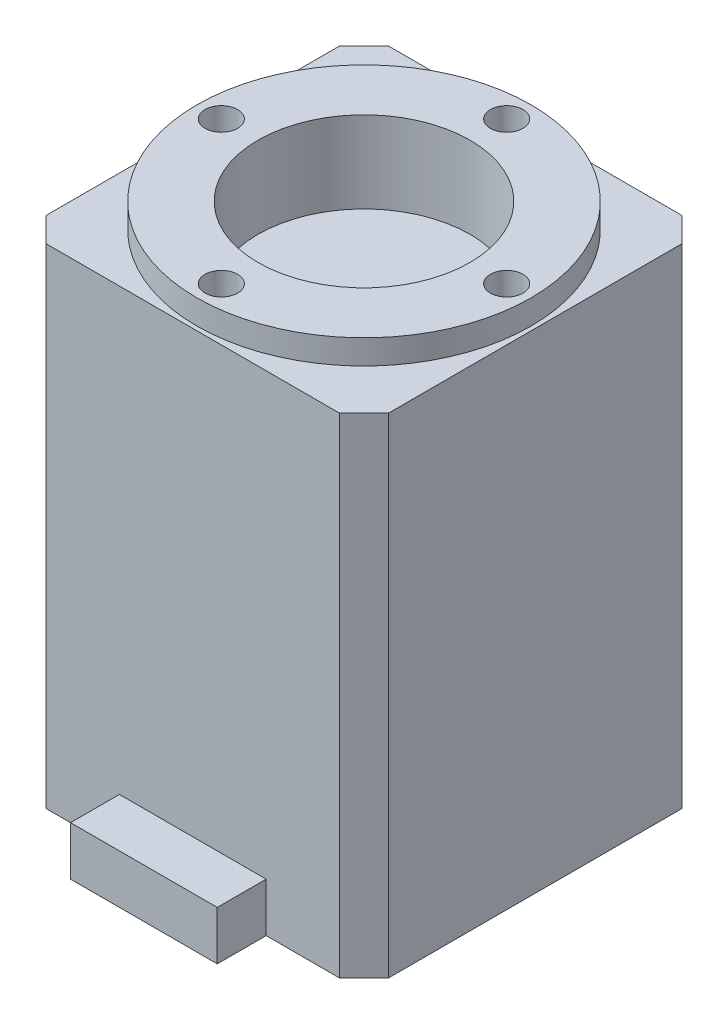
ISO-10303-21;
HEADER;
FILE_DESCRIPTION(('STEP AP214'),'2;1');
FILE_NAME('part.step','',(''),(''),'','','');
FILE_SCHEMA(('AUTOMOTIVE_DESIGN { 1 0 10303 214 1 1 1 1 }'));
ENDSEC;
DATA;
#1=APPLICATION_CONTEXT('core data for automotive mechanical design processes');
#2=APPLICATION_PROTOCOL_DEFINITION('international standard','automotive_design',2000,#1);
#3=PRODUCT_CONTEXT('',#1,'mechanical');
#4=PRODUCT('Part','Part','',(#3));
#5=PRODUCT_RELATED_PRODUCT_CATEGORY('part','',(#4));
#6=PRODUCT_DEFINITION_FORMATION('','',#4);
#7=PRODUCT_DEFINITION_CONTEXT('part definition',#1,'design');
#8=PRODUCT_DEFINITION('design','',#6,#7);
#9=PRODUCT_DEFINITION_SHAPE('','',#8);
#10=(LENGTH_UNIT() NAMED_UNIT(*) SI_UNIT(.MILLI.,.METRE.));
#11=(NAMED_UNIT(*) PLANE_ANGLE_UNIT() SI_UNIT($,.RADIAN.));
#12=(NAMED_UNIT(*) SI_UNIT($,.STERADIAN.) SOLID_ANGLE_UNIT());
#13=UNCERTAINTY_MEASURE_WITH_UNIT(LENGTH_MEASURE(1.E-05),#10,'distance_accuracy_value','');
#14=(GEOMETRIC_REPRESENTATION_CONTEXT(3) GLOBAL_UNCERTAINTY_ASSIGNED_CONTEXT((#13)) GLOBAL_UNIT_ASSIGNED_CONTEXT((#10,
#11,#12)) REPRESENTATION_CONTEXT('',''));
#15=CARTESIAN_POINT('',(0.,0.,0.));
#16=DIRECTION('',(0.,0.,1.));
#17=DIRECTION('',(1.,0.,0.));
#18=AXIS2_PLACEMENT_3D('',#15,#16,#17);
#19=CARTESIAN_POINT('',(0.,60.,0.));
#20=DIRECTION('',(0.,0.,-1.));
#21=DIRECTION('',(-1.,0.,0.));
#22=AXIS2_PLACEMENT_3D('',#19,#20,#21);
#23=PLANE('',#22);
#24=DIRECTION('',(0.,-1.,0.));
#25=VECTOR('',#24,1.);
#26=CARTESIAN_POINT('',(12.,6.,0.));
#27=LINE('',#26,#25);
#28=CARTESIAN_POINT('',(12.,6.,0.));
#29=VERTEX_POINT('',#28);
#30=CARTESIAN_POINT('',(12.,0.,0.));
#31=VERTEX_POINT('',#30);
#32=EDGE_CURVE('E63',#29,#31,#27,.T.);
#33=ORIENTED_EDGE('',*,*,#32,.F.);
#34=DIRECTION('',(-1.,0.,0.));
#35=VECTOR('',#34,1.);
#36=CARTESIAN_POINT('',(12.,6.,0.));
#37=LINE('',#36,#35);
#38=CARTESIAN_POINT('',(30.,6.,0.));
#39=VERTEX_POINT('',#38);
#40=EDGE_CURVE('E157',#39,#29,#37,.T.);
#41=ORIENTED_EDGE('',*,*,#40,.F.);
#42=DIRECTION('',(0.,1.,0.));
#43=VECTOR('',#42,1.);
#44=CARTESIAN_POINT('',(30.,6.,0.));
#45=LINE('',#44,#43);
#46=CARTESIAN_POINT('',(30.,0.,0.));
#47=VERTEX_POINT('',#46);
#48=EDGE_CURVE('E69',#47,#39,#45,.T.);
#49=ORIENTED_EDGE('',*,*,#48,.F.);
#50=DIRECTION('',(1.,0.,0.));
#51=VECTOR('',#50,1.);
#52=CARTESIAN_POINT('',(0.,0.,0.));
#53=LINE('',#52,#51);
#54=CARTESIAN_POINT('',(39.,0.,0.));
#55=VERTEX_POINT('',#54);
#56=EDGE_CURVE('E218',#47,#55,#53,.T.);
#57=ORIENTED_EDGE('',*,*,#56,.T.);
#58=DIRECTION('',(0.,1.,0.));
#59=VECTOR('',#58,1.);
#60=CARTESIAN_POINT('',(39.,60.,0.));
#61=LINE('',#60,#59);
#62=CARTESIAN_POINT('',(39.,60.,0.));
#63=VERTEX_POINT('',#62);
#64=EDGE_CURVE('E255',#55,#63,#61,.T.);
#65=ORIENTED_EDGE('',*,*,#64,.T.);
#66=DIRECTION('',(1.,0.,0.));
#67=VECTOR('',#66,1.);
#68=CARTESIAN_POINT('',(0.,60.,0.));
#69=LINE('',#68,#67);
#70=CARTESIAN_POINT('',(3.,60.,0.));
#71=VERTEX_POINT('',#70);
#72=EDGE_CURVE('E207',#71,#63,#69,.T.);
#73=ORIENTED_EDGE('',*,*,#72,.F.);
#74=DIRECTION('',(0.,-1.,0.));
#75=VECTOR('',#74,1.);
#76=CARTESIAN_POINT('',(3.,60.,0.));
#77=LINE('',#76,#75);
#78=CARTESIAN_POINT('',(3.,0.,0.));
#79=VERTEX_POINT('',#78);
#80=EDGE_CURVE('E252',#71,#79,#77,.T.);
#81=ORIENTED_EDGE('',*,*,#80,.T.);
#82=EDGE_CURVE('E219',#79,#31,#53,.T.);
#83=ORIENTED_EDGE('',*,*,#82,.T.);
#84=EDGE_LOOP('',(#33,#41,#49,#57,#65,#73,#81,#83));
#85=FACE_BOUND('',#84,.T.);
#86=ADVANCED_FACE('F47',(#85),#23,.F.);
#87=CARTESIAN_POINT('',(0.,60.,0.));
#88=DIRECTION('',(1.,0.,0.));
#89=DIRECTION('',(0.,0.,-1.));
#90=AXIS2_PLACEMENT_3D('',#87,#88,#89);
#91=PLANE('',#90);
#92=DIRECTION('',(0.,0.,1.));
#93=VECTOR('',#92,1.);
#94=CARTESIAN_POINT('',(0.,60.,0.));
#95=LINE('',#94,#93);
#96=CARTESIAN_POINT('',(0.,60.,-39.));
#97=VERTEX_POINT('',#96);
#98=CARTESIAN_POINT('',(0.,60.,-2.99999999999999));
#99=VERTEX_POINT('',#98);
#100=EDGE_CURVE('E204',#97,#99,#95,.T.);
#101=ORIENTED_EDGE('',*,*,#100,.F.);
#102=DIRECTION('',(0.,-1.,0.));
#103=VECTOR('',#102,1.);
#104=CARTESIAN_POINT('',(0.,60.,-39.));
#105=LINE('',#104,#103);
#106=CARTESIAN_POINT('',(0.,0.,-39.));
#107=VERTEX_POINT('',#106);
#108=EDGE_CURVE('E11',#97,#107,#105,.T.);
#109=ORIENTED_EDGE('',*,*,#108,.T.);
#110=DIRECTION('',(0.,0.,1.));
#111=VECTOR('',#110,1.);
#112=CARTESIAN_POINT('',(0.,0.,0.));
#113=LINE('',#112,#111);
#114=CARTESIAN_POINT('',(0.,0.,-2.99999999999999));
#115=VERTEX_POINT('',#114);
#116=EDGE_CURVE('E198',#107,#115,#113,.T.);
#117=ORIENTED_EDGE('',*,*,#116,.T.);
#118=DIRECTION('',(0.,1.,0.));
#119=VECTOR('',#118,1.);
#120=CARTESIAN_POINT('',(0.,60.,-2.99999999999999));
#121=LINE('',#120,#119);
#122=EDGE_CURVE('E56',#115,#99,#121,.T.);
#123=ORIENTED_EDGE('',*,*,#122,.T.);
#124=EDGE_LOOP('',(#101,#109,#117,#123));
#125=FACE_BOUND('',#124,.T.);
#126=ADVANCED_FACE('F259',(#125),#91,.F.);
#127=CARTESIAN_POINT('',(42.,60.,0.));
#128=DIRECTION('',(-1.,0.,0.));
#129=DIRECTION('',(0.,0.,1.));
#130=AXIS2_PLACEMENT_3D('',#127,#128,#129);
#131=PLANE('',#130);
#132=DIRECTION('',(0.,0.,-1.));
#133=VECTOR('',#132,1.);
#134=CARTESIAN_POINT('',(42.,0.,0.));
#135=LINE('',#134,#133);
#136=CARTESIAN_POINT('',(42.,0.,-3.));
#137=VERTEX_POINT('',#136);
#138=CARTESIAN_POINT('',(42.,0.,-39.));
#139=VERTEX_POINT('',#138);
#140=EDGE_CURVE('E221',#137,#139,#135,.T.);
#141=ORIENTED_EDGE('',*,*,#140,.T.);
#142=DIRECTION('',(0.,1.,0.));
#143=VECTOR('',#142,1.);
#144=CARTESIAN_POINT('',(42.,60.,-39.));
#145=LINE('',#144,#143);
#146=CARTESIAN_POINT('',(42.,60.,-39.));
#147=VERTEX_POINT('',#146);
#148=EDGE_CURVE('E242',#139,#147,#145,.T.);
#149=ORIENTED_EDGE('',*,*,#148,.T.);
#150=DIRECTION('',(0.,0.,-1.));
#151=VECTOR('',#150,1.);
#152=CARTESIAN_POINT('',(42.,60.,0.));
#153=LINE('',#152,#151);
#154=CARTESIAN_POINT('',(42.,60.,-3.));
#155=VERTEX_POINT('',#154);
#156=EDGE_CURVE('E211',#155,#147,#153,.T.);
#157=ORIENTED_EDGE('',*,*,#156,.F.);
#158=DIRECTION('',(0.,-1.,0.));
#159=VECTOR('',#158,1.);
#160=CARTESIAN_POINT('',(42.,60.,-3.));
#161=LINE('',#160,#159);
#162=EDGE_CURVE('E239',#155,#137,#161,.T.);
#163=ORIENTED_EDGE('',*,*,#162,.T.);
#164=EDGE_LOOP('',(#141,#149,#157,#163));
#165=FACE_BOUND('',#164,.T.);
#166=ADVANCED_FACE('F292',(#165),#131,.F.);
#167=CARTESIAN_POINT('',(0.,60.,-42.));
#168=DIRECTION('',(0.,0.,1.));
#169=DIRECTION('',(1.,0.,0.));
#170=AXIS2_PLACEMENT_3D('',#167,#168,#169);
#171=PLANE('',#170);
#172=DIRECTION('',(-1.,0.,0.));
#173=VECTOR('',#172,1.);
#174=CARTESIAN_POINT('',(0.,60.,-42.));
#175=LINE('',#174,#173);
#176=CARTESIAN_POINT('',(39.,60.,-42.));
#177=VERTEX_POINT('',#176);
#178=CARTESIAN_POINT('',(3.00000000000002,60.,-42.));
#179=VERTEX_POINT('',#178);
#180=EDGE_CURVE('E203',#177,#179,#175,.T.);
#181=ORIENTED_EDGE('',*,*,#180,.F.);
#182=DIRECTION('',(0.,-1.,0.));
#183=VECTOR('',#182,1.);
#184=CARTESIAN_POINT('',(39.,60.,-42.));
#185=LINE('',#184,#183);
#186=CARTESIAN_POINT('',(39.,0.,-42.));
#187=VERTEX_POINT('',#186);
#188=EDGE_CURVE('E227',#177,#187,#185,.T.);
#189=ORIENTED_EDGE('',*,*,#188,.T.);
#190=DIRECTION('',(-1.,0.,0.));
#191=VECTOR('',#190,1.);
#192=CARTESIAN_POINT('',(0.,0.,-42.));
#193=LINE('',#192,#191);
#194=CARTESIAN_POINT('',(3.00000000000002,0.,-42.));
#195=VERTEX_POINT('',#194);
#196=EDGE_CURVE('E208',#187,#195,#193,.T.);
#197=ORIENTED_EDGE('',*,*,#196,.T.);
#198=DIRECTION('',(0.,1.,0.));
#199=VECTOR('',#198,1.);
#200=CARTESIAN_POINT('',(3.00000000000002,60.,-42.));
#201=LINE('',#200,#199);
#202=EDGE_CURVE('E202',#195,#179,#201,.T.);
#203=ORIENTED_EDGE('',*,*,#202,.T.);
#204=EDGE_LOOP('',(#181,#189,#197,#203));
#205=FACE_BOUND('',#204,.T.);
#206=ADVANCED_FACE('F273',(#205),#171,.F.);
#207=CARTESIAN_POINT('',(0.,60.,0.));
#208=DIRECTION('',(0.,-1.,0.));
#209=DIRECTION('',(0.,0.,-1.));
#210=AXIS2_PLACEMENT_3D('',#207,#208,#209);
#211=PLANE('',#210);
#212=CARTESIAN_POINT('',(21.,60.,-21.));
#213=DIRECTION('',(0.,1.,0.));
#214=DIRECTION('',(0.,0.,1.));
#215=AXIS2_PLACEMENT_3D('',#212,#213,#214);
#216=CIRCLE('',#215,20.5);
#217=CARTESIAN_POINT('',(21.,60.,-0.499999999999997));
#218=VERTEX_POINT('',#217);
#219=EDGE_CURVE('E199',#218,#218,#216,.T.);
#220=ORIENTED_EDGE('',*,*,#219,.F.);
#221=EDGE_LOOP('',(#220));
#222=FACE_BOUND('',#221,.T.);
#223=ORIENTED_EDGE('',*,*,#156,.T.);
#224=DIRECTION('',(0.707106781186544,0.,0.707106781186551));
#225=VECTOR('',#224,1.);
#226=CARTESIAN_POINT('',(39.,60.,-42.));
#227=LINE('',#226,#225);
#228=EDGE_CURVE('E250',#147,#177,#227,.F.);
#229=ORIENTED_EDGE('',*,*,#228,.T.);
#230=ORIENTED_EDGE('',*,*,#180,.T.);
#231=DIRECTION('',(0.70710678118655,0.,-0.707106781186545));
#232=VECTOR('',#231,1.);
#233=CARTESIAN_POINT('',(0.,60.,-39.));
#234=LINE('',#233,#232);
#235=EDGE_CURVE('E246',#179,#97,#234,.F.);
#236=ORIENTED_EDGE('',*,*,#235,.T.);
#237=ORIENTED_EDGE('',*,*,#100,.T.);
#238=DIRECTION('',(-0.707106781186548,0.,-0.707106781186547));
#239=VECTOR('',#238,1.);
#240=CARTESIAN_POINT('',(3.,60.,0.));
#241=LINE('',#240,#239);
#242=EDGE_CURVE('E244',#99,#71,#241,.F.);
#243=ORIENTED_EDGE('',*,*,#242,.T.);
#244=ORIENTED_EDGE('',*,*,#72,.T.);
#245=DIRECTION('',(-0.707106781186548,0.,0.707106781186547));
#246=VECTOR('',#245,1.);
#247=CARTESIAN_POINT('',(42.,60.,-3.));
#248=LINE('',#247,#246);
#249=EDGE_CURVE('E248',#63,#155,#248,.F.);
#250=ORIENTED_EDGE('',*,*,#249,.T.);
#251=EDGE_LOOP('',(#223,#229,#230,#236,#237,#243,#244,#250));
#252=FACE_BOUND('',#251,.T.);
#253=ADVANCED_FACE('F265',(#222,#252),#211,.F.);
#254=CARTESIAN_POINT('',(0.,0.,0.));
#255=DIRECTION('',(0.,-1.,0.));
#256=DIRECTION('',(0.,0.,-1.));
#257=AXIS2_PLACEMENT_3D('',#254,#255,#256);
#258=PLANE('',#257);
#259=ORIENTED_EDGE('',*,*,#196,.F.);
#260=DIRECTION('',(-0.707106781186544,0.,-0.707106781186551));
#261=VECTOR('',#260,1.);
#262=CARTESIAN_POINT('',(40.5000000000002,0.,-40.4999999999998));
#263=LINE('',#262,#261);
#264=EDGE_CURVE('E237',#187,#139,#263,.F.);
#265=ORIENTED_EDGE('',*,*,#264,.T.);
#266=ORIENTED_EDGE('',*,*,#140,.F.);
#267=DIRECTION('',(0.707106781186548,0.,-0.707106781186547));
#268=VECTOR('',#267,1.);
#269=CARTESIAN_POINT('',(19.5,0.,19.5));
#270=LINE('',#269,#268);
#271=EDGE_CURVE('E234',#137,#55,#270,.F.);
#272=ORIENTED_EDGE('',*,*,#271,.T.);
#273=ORIENTED_EDGE('',*,*,#56,.F.);
#274=DIRECTION('',(0.,0.,-1.));
#275=VECTOR('',#274,1.);
#276=CARTESIAN_POINT('',(30.,0.,6.));
#277=LINE('',#276,#275);
#278=CARTESIAN_POINT('',(30.,0.,6.));
#279=VERTEX_POINT('',#278);
#280=EDGE_CURVE('E144',#279,#47,#277,.T.);
#281=ORIENTED_EDGE('',*,*,#280,.F.);
#282=DIRECTION('',(1.,0.,0.));
#283=VECTOR('',#282,1.);
#284=CARTESIAN_POINT('',(12.,0.,6.));
#285=LINE('',#284,#283);
#286=CARTESIAN_POINT('',(12.,0.,6.));
#287=VERTEX_POINT('',#286);
#288=EDGE_CURVE('E136',#287,#279,#285,.T.);
#289=ORIENTED_EDGE('',*,*,#288,.F.);
#290=DIRECTION('',(0.,0.,-1.));
#291=VECTOR('',#290,1.);
#292=CARTESIAN_POINT('',(12.,0.,6.));
#293=LINE('',#292,#291);
#294=EDGE_CURVE('E142',#287,#31,#293,.T.);
#295=ORIENTED_EDGE('',*,*,#294,.T.);
#296=ORIENTED_EDGE('',*,*,#82,.F.);
#297=DIRECTION('',(0.707106781186548,0.,0.707106781186547));
#298=VECTOR('',#297,1.);
#299=CARTESIAN_POINT('',(1.5,0.,-1.5));
#300=LINE('',#299,#298);
#301=EDGE_CURVE('E230',#79,#115,#300,.F.);
#302=ORIENTED_EDGE('',*,*,#301,.T.);
#303=ORIENTED_EDGE('',*,*,#116,.F.);
#304=DIRECTION('',(-0.70710678118655,0.,0.707106781186545));
#305=VECTOR('',#304,1.);
#306=CARTESIAN_POINT('',(-19.5,0.,-19.5000000000001));
#307=LINE('',#306,#305);
#308=EDGE_CURVE('E232',#107,#195,#307,.F.);
#309=ORIENTED_EDGE('',*,*,#308,.T.);
#310=EDGE_LOOP('',(#259,#265,#266,#272,#273,#281,#289,#295,#296,#302,#303,#309));
#311=FACE_BOUND('',#310,.T.);
#312=ADVANCED_FACE('F139',(#311),#258,.T.);
#313=CARTESIAN_POINT('',(21.,63.,-21.));
#314=DIRECTION('',(0.,-1.,0.));
#315=DIRECTION('',(0.,0.,-1.));
#316=AXIS2_PLACEMENT_3D('',#313,#314,#315);
#317=CYLINDRICAL_SURFACE('',#316,20.5);
#318=CARTESIAN_POINT('',(21.,63.,-21.));
#319=DIRECTION('',(0.,1.,0.));
#320=DIRECTION('',(0.,0.,1.));
#321=AXIS2_PLACEMENT_3D('',#318,#319,#320);
#322=CIRCLE('',#321,20.5);
#323=CARTESIAN_POINT('',(21.,63.,-0.499999999999997));
#324=VERTEX_POINT('',#323);
#325=EDGE_CURVE('E193',#324,#324,#322,.T.);
#326=ORIENTED_EDGE('',*,*,#325,.F.);
#327=EDGE_LOOP('',(#326));
#328=FACE_BOUND('',#327,.T.);
#329=ORIENTED_EDGE('',*,*,#219,.T.);
#330=EDGE_LOOP('',(#329));
#331=FACE_BOUND('',#330,.T.);
#332=ADVANCED_FACE('F386',(#328,#331),#317,.T.);
#333=CARTESIAN_POINT('',(21.,63.,-21.));
#334=DIRECTION('',(0.,1.,0.));
#335=DIRECTION('',(0.,0.,1.));
#336=AXIS2_PLACEMENT_3D('',#333,#334,#335);
#337=PLANE('',#336);
#338=CARTESIAN_POINT('',(3.5,63.,-21.));
#339=DIRECTION('',(0.,1.,0.));
#340=DIRECTION('',(0.,0.,1.));
#341=AXIS2_PLACEMENT_3D('',#338,#339,#340);
#342=CIRCLE('',#341,2.);
#343=CARTESIAN_POINT('',(3.5,63.,-19.));
#344=VERTEX_POINT('',#343);
#345=EDGE_CURVE('E173',#344,#344,#342,.T.);
#346=ORIENTED_EDGE('',*,*,#345,.F.);
#347=EDGE_LOOP('',(#346));
#348=FACE_BOUND('',#347,.T.);
#349=CARTESIAN_POINT('',(21.,63.,-38.5));
#350=DIRECTION('',(0.,1.,0.));
#351=DIRECTION('',(0.,0.,1.));
#352=AXIS2_PLACEMENT_3D('',#349,#350,#351);
#353=CIRCLE('',#352,2.00000000000001);
#354=CARTESIAN_POINT('',(21.,63.,-36.5));
#355=VERTEX_POINT('',#354);
#356=EDGE_CURVE('E176',#355,#355,#353,.T.);
#357=ORIENTED_EDGE('',*,*,#356,.F.);
#358=EDGE_LOOP('',(#357));
#359=FACE_BOUND('',#358,.T.);
#360=CARTESIAN_POINT('',(38.5,63.,-21.));
#361=DIRECTION('',(0.,1.,0.));
#362=DIRECTION('',(0.,0.,1.));
#363=AXIS2_PLACEMENT_3D('',#360,#361,#362);
#364=CIRCLE('',#363,2.);
#365=CARTESIAN_POINT('',(38.5,63.,-19.));
#366=VERTEX_POINT('',#365);
#367=EDGE_CURVE('E182',#366,#366,#364,.T.);
#368=ORIENTED_EDGE('',*,*,#367,.F.);
#369=EDGE_LOOP('',(#368));
#370=FACE_BOUND('',#369,.T.);
#371=CARTESIAN_POINT('',(21.,63.,-3.5));
#372=DIRECTION('',(0.,1.,0.));
#373=DIRECTION('',(0.,0.,1.));
#374=AXIS2_PLACEMENT_3D('',#371,#372,#373);
#375=CIRCLE('',#374,2.);
#376=CARTESIAN_POINT('',(21.,63.,-1.5));
#377=VERTEX_POINT('',#376);
#378=EDGE_CURVE('E163',#377,#377,#375,.T.);
#379=ORIENTED_EDGE('',*,*,#378,.F.);
#380=EDGE_LOOP('',(#379));
#381=FACE_BOUND('',#380,.T.);
#382=CARTESIAN_POINT('',(21.,63.,-21.));
#383=DIRECTION('',(0.,1.,0.));
#384=DIRECTION('',(0.,0.,1.));
#385=AXIS2_PLACEMENT_3D('',#382,#383,#384);
#386=CIRCLE('',#385,13.);
#387=CARTESIAN_POINT('',(21.,63.,-8.));
#388=VERTEX_POINT('',#387);
#389=EDGE_CURVE('E172',#388,#388,#386,.T.);
#390=ORIENTED_EDGE('',*,*,#389,.F.);
#391=EDGE_LOOP('',(#390));
#392=FACE_BOUND('',#391,.T.);
#393=ORIENTED_EDGE('',*,*,#325,.T.);
#394=EDGE_LOOP('',(#393));
#395=FACE_BOUND('',#394,.T.);
#396=ADVANCED_FACE('F382',(#348,#359,#370,#381,#392,#395),#337,.T.);
#397=CARTESIAN_POINT('',(21.,53.,-21.));
#398=DIRECTION('',(0.,1.,0.));
#399=DIRECTION('',(0.,0.,1.));
#400=AXIS2_PLACEMENT_3D('',#397,#398,#399);
#401=CYLINDRICAL_SURFACE('',#400,13.);
#402=CARTESIAN_POINT('',(21.,53.,-21.));
#403=DIRECTION('',(0.,1.,0.));
#404=DIRECTION('',(0.,0.,1.));
#405=AXIS2_PLACEMENT_3D('',#402,#403,#404);
#406=CIRCLE('',#405,13.);
#407=CARTESIAN_POINT('',(21.,53.,-8.));
#408=VERTEX_POINT('',#407);
#409=EDGE_CURVE('E190',#408,#408,#406,.T.);
#410=ORIENTED_EDGE('',*,*,#409,.F.);
#411=EDGE_LOOP('',(#410));
#412=FACE_BOUND('',#411,.T.);
#413=ORIENTED_EDGE('',*,*,#389,.T.);
#414=EDGE_LOOP('',(#413));
#415=FACE_BOUND('',#414,.T.);
#416=ADVANCED_FACE('F378',(#412,#415),#401,.F.);
#417=CARTESIAN_POINT('',(21.,53.,-21.));
#418=DIRECTION('',(0.,1.,0.));
#419=DIRECTION('',(0.,0.,1.));
#420=AXIS2_PLACEMENT_3D('',#417,#418,#419);
#421=PLANE('',#420);
#422=ORIENTED_EDGE('',*,*,#409,.T.);
#423=EDGE_LOOP('',(#422));
#424=FACE_BOUND('',#423,.T.);
#425=ADVANCED_FACE('F371',(#424),#421,.T.);
#426=CARTESIAN_POINT('',(21.,59.5,-3.5));
#427=DIRECTION('',(0.,1.,0.));
#428=DIRECTION('',(0.,0.,1.));
#429=AXIS2_PLACEMENT_3D('',#426,#427,#428);
#430=CYLINDRICAL_SURFACE('',#429,2.);
#431=CARTESIAN_POINT('',(21.,59.5,-3.5));
#432=DIRECTION('',(0.,1.,0.));
#433=DIRECTION('',(0.,0.,1.));
#434=AXIS2_PLACEMENT_3D('',#431,#432,#433);
#435=CIRCLE('',#434,2.);
#436=CARTESIAN_POINT('',(21.,59.5,-1.5));
#437=VERTEX_POINT('',#436);
#438=EDGE_CURVE('E160',#437,#437,#435,.T.);
#439=ORIENTED_EDGE('',*,*,#438,.F.);
#440=EDGE_LOOP('',(#439));
#441=FACE_BOUND('',#440,.T.);
#442=ORIENTED_EDGE('',*,*,#378,.T.);
#443=EDGE_LOOP('',(#442));
#444=FACE_BOUND('',#443,.T.);
#445=ADVANCED_FACE('F368',(#441,#444),#430,.F.);
#446=CARTESIAN_POINT('',(21.,59.5,-3.5));
#447=DIRECTION('',(0.,1.,0.));
#448=DIRECTION('',(0.,0.,1.));
#449=AXIS2_PLACEMENT_3D('',#446,#447,#448);
#450=PLANE('',#449);
#451=ORIENTED_EDGE('',*,*,#438,.T.);
#452=EDGE_LOOP('',(#451));
#453=FACE_BOUND('',#452,.T.);
#454=ADVANCED_FACE('F363',(#453),#450,.T.);
#455=CARTESIAN_POINT('',(38.5,59.5,-21.));
#456=DIRECTION('',(0.,1.,0.));
#457=DIRECTION('',(0.,0.,1.));
#458=AXIS2_PLACEMENT_3D('',#455,#456,#457);
#459=CYLINDRICAL_SURFACE('',#458,2.);
#460=CARTESIAN_POINT('',(38.5,59.5,-21.));
#461=DIRECTION('',(0.,1.,0.));
#462=DIRECTION('',(0.,0.,1.));
#463=AXIS2_PLACEMENT_3D('',#460,#461,#462);
#464=CIRCLE('',#463,2.);
#465=CARTESIAN_POINT('',(38.5,59.5,-19.));
#466=VERTEX_POINT('',#465);
#467=EDGE_CURVE('E185',#466,#466,#464,.T.);
#468=ORIENTED_EDGE('',*,*,#467,.F.);
#469=EDGE_LOOP('',(#468));
#470=FACE_BOUND('',#469,.T.);
#471=ORIENTED_EDGE('',*,*,#367,.T.);
#472=EDGE_LOOP('',(#471));
#473=FACE_BOUND('',#472,.T.);
#474=ADVANCED_FACE('F360',(#470,#473),#459,.F.);
#475=CARTESIAN_POINT('',(38.5,59.5,-21.));
#476=DIRECTION('',(0.,1.,0.));
#477=DIRECTION('',(0.,0.,1.));
#478=AXIS2_PLACEMENT_3D('',#475,#476,#477);
#479=PLANE('',#478);
#480=ORIENTED_EDGE('',*,*,#467,.T.);
#481=EDGE_LOOP('',(#480));
#482=FACE_BOUND('',#481,.T.);
#483=ADVANCED_FACE('F355',(#482),#479,.T.);
#484=CARTESIAN_POINT('',(21.,59.5,-38.5));
#485=DIRECTION('',(0.,1.,0.));
#486=DIRECTION('',(0.,0.,1.));
#487=AXIS2_PLACEMENT_3D('',#484,#485,#486);
#488=CYLINDRICAL_SURFACE('',#487,2.00000000000001);
#489=CARTESIAN_POINT('',(21.,59.5,-38.5));
#490=DIRECTION('',(0.,1.,0.));
#491=DIRECTION('',(0.,0.,1.));
#492=AXIS2_PLACEMENT_3D('',#489,#490,#491);
#493=CIRCLE('',#492,2.00000000000001);
#494=CARTESIAN_POINT('',(21.,59.5,-36.5));
#495=VERTEX_POINT('',#494);
#496=EDGE_CURVE('E179',#495,#495,#493,.T.);
#497=ORIENTED_EDGE('',*,*,#496,.F.);
#498=EDGE_LOOP('',(#497));
#499=FACE_BOUND('',#498,.T.);
#500=ORIENTED_EDGE('',*,*,#356,.T.);
#501=EDGE_LOOP('',(#500));
#502=FACE_BOUND('',#501,.T.);
#503=ADVANCED_FACE('F352',(#499,#502),#488,.F.);
#504=CARTESIAN_POINT('',(21.,59.5,-38.5));
#505=DIRECTION('',(0.,1.,0.));
#506=DIRECTION('',(0.,0.,1.));
#507=AXIS2_PLACEMENT_3D('',#504,#505,#506);
#508=PLANE('',#507);
#509=ORIENTED_EDGE('',*,*,#496,.T.);
#510=EDGE_LOOP('',(#509));
#511=FACE_BOUND('',#510,.T.);
#512=ADVANCED_FACE('F350',(#511),#508,.T.);
#513=CARTESIAN_POINT('',(3.5,59.5,-21.));
#514=DIRECTION('',(0.,1.,0.));
#515=DIRECTION('',(0.,0.,1.));
#516=AXIS2_PLACEMENT_3D('',#513,#514,#515);
#517=CYLINDRICAL_SURFACE('',#516,2.);
#518=CARTESIAN_POINT('',(3.5,59.5,-21.));
#519=DIRECTION('',(0.,1.,0.));
#520=DIRECTION('',(0.,0.,1.));
#521=AXIS2_PLACEMENT_3D('',#518,#519,#520);
#522=CIRCLE('',#521,2.);
#523=CARTESIAN_POINT('',(3.5,59.5,-19.));
#524=VERTEX_POINT('',#523);
#525=EDGE_CURVE('E169',#524,#524,#522,.T.);
#526=ORIENTED_EDGE('',*,*,#525,.F.);
#527=EDGE_LOOP('',(#526));
#528=FACE_BOUND('',#527,.T.);
#529=ORIENTED_EDGE('',*,*,#345,.T.);
#530=EDGE_LOOP('',(#529));
#531=FACE_BOUND('',#530,.T.);
#532=ADVANCED_FACE('F313',(#528,#531),#517,.F.);
#533=CARTESIAN_POINT('',(3.5,59.5,-21.));
#534=DIRECTION('',(0.,1.,0.));
#535=DIRECTION('',(0.,0.,1.));
#536=AXIS2_PLACEMENT_3D('',#533,#534,#535);
#537=PLANE('',#536);
#538=ORIENTED_EDGE('',*,*,#525,.T.);
#539=EDGE_LOOP('',(#538));
#540=FACE_BOUND('',#539,.T.);
#541=ADVANCED_FACE('F302',(#540),#537,.T.);
#542=CARTESIAN_POINT('',(39.,60.,-42.));
#543=DIRECTION('',(-0.707106781186551,0.,0.707106781186544));
#544=DIRECTION('',(0.,-1.,0.));
#545=AXIS2_PLACEMENT_3D('',#542,#543,#544);
#546=PLANE('',#545);
#547=ORIENTED_EDGE('',*,*,#228,.F.);
#548=ORIENTED_EDGE('',*,*,#148,.F.);
#549=ORIENTED_EDGE('',*,*,#264,.F.);
#550=ORIENTED_EDGE('',*,*,#188,.F.);
#551=EDGE_LOOP('',(#547,#548,#549,#550));
#552=FACE_BOUND('',#551,.T.);
#553=ADVANCED_FACE('F282',(#552),#546,.F.);
#554=CARTESIAN_POINT('',(42.,60.,-3.));
#555=DIRECTION('',(-0.707106781186547,0.,-0.707106781186548));
#556=DIRECTION('',(0.,-1.,0.));
#557=AXIS2_PLACEMENT_3D('',#554,#555,#556);
#558=PLANE('',#557);
#559=ORIENTED_EDGE('',*,*,#249,.F.);
#560=ORIENTED_EDGE('',*,*,#64,.F.);
#561=ORIENTED_EDGE('',*,*,#271,.F.);
#562=ORIENTED_EDGE('',*,*,#162,.F.);
#563=EDGE_LOOP('',(#559,#560,#561,#562));
#564=FACE_BOUND('',#563,.T.);
#565=ADVANCED_FACE('F277',(#564),#558,.F.);
#566=CARTESIAN_POINT('',(0.,60.,-39.));
#567=DIRECTION('',(0.707106781186545,0.,0.70710678118655));
#568=DIRECTION('',(0.,-1.,0.));
#569=AXIS2_PLACEMENT_3D('',#566,#567,#568);
#570=PLANE('',#569);
#571=ORIENTED_EDGE('',*,*,#235,.F.);
#572=ORIENTED_EDGE('',*,*,#202,.F.);
#573=ORIENTED_EDGE('',*,*,#308,.F.);
#574=ORIENTED_EDGE('',*,*,#108,.F.);
#575=EDGE_LOOP('',(#571,#572,#573,#574));
#576=FACE_BOUND('',#575,.T.);
#577=ADVANCED_FACE('F275',(#576),#570,.F.);
#578=CARTESIAN_POINT('',(3.,60.,0.));
#579=DIRECTION('',(0.707106781186547,0.,-0.707106781186548));
#580=DIRECTION('',(0.,-1.,0.));
#581=AXIS2_PLACEMENT_3D('',#578,#579,#580);
#582=PLANE('',#581);
#583=ORIENTED_EDGE('',*,*,#242,.F.);
#584=ORIENTED_EDGE('',*,*,#122,.F.);
#585=ORIENTED_EDGE('',*,*,#301,.F.);
#586=ORIENTED_EDGE('',*,*,#80,.F.);
#587=EDGE_LOOP('',(#583,#584,#585,#586));
#588=FACE_BOUND('',#587,.T.);
#589=ADVANCED_FACE('F50',(#588),#582,.F.);
#590=CARTESIAN_POINT('',(12.,6.,6.));
#591=DIRECTION('',(1.,0.,0.));
#592=DIRECTION('',(0.,1.,0.));
#593=AXIS2_PLACEMENT_3D('',#590,#591,#592);
#594=PLANE('',#593);
#595=ORIENTED_EDGE('',*,*,#32,.T.);
#596=ORIENTED_EDGE('',*,*,#294,.F.);
#597=DIRECTION('',(0.,-1.,0.));
#598=VECTOR('',#597,1.);
#599=CARTESIAN_POINT('',(12.,6.,6.));
#600=LINE('',#599,#598);
#601=CARTESIAN_POINT('',(12.,6.,6.));
#602=VERTEX_POINT('',#601);
#603=EDGE_CURVE('E148',#602,#287,#600,.T.);
#604=ORIENTED_EDGE('',*,*,#603,.F.);
#605=DIRECTION('',(0.,0.,-1.));
#606=VECTOR('',#605,1.);
#607=CARTESIAN_POINT('',(12.,6.,6.));
#608=LINE('',#607,#606);
#609=EDGE_CURVE('E329',#602,#29,#608,.T.);
#610=ORIENTED_EDGE('',*,*,#609,.T.);
#611=EDGE_LOOP('',(#595,#596,#604,#610));
#612=FACE_BOUND('',#611,.T.);
#613=ADVANCED_FACE('F159',(#612),#594,.F.);
#614=CARTESIAN_POINT('',(30.,6.,6.));
#615=DIRECTION('',(-1.,0.,0.));
#616=DIRECTION('',(0.,0.,1.));
#617=AXIS2_PLACEMENT_3D('',#614,#615,#616);
#618=PLANE('',#617);
#619=ORIENTED_EDGE('',*,*,#48,.T.);
#620=DIRECTION('',(0.,0.,-1.));
#621=VECTOR('',#620,1.);
#622=CARTESIAN_POINT('',(30.,6.,6.));
#623=LINE('',#622,#621);
#624=CARTESIAN_POINT('',(30.,6.,6.));
#625=VERTEX_POINT('',#624);
#626=EDGE_CURVE('E165',#625,#39,#623,.T.);
#627=ORIENTED_EDGE('',*,*,#626,.F.);
#628=DIRECTION('',(0.,1.,0.));
#629=VECTOR('',#628,1.);
#630=CARTESIAN_POINT('',(30.,6.,6.));
#631=LINE('',#630,#629);
#632=EDGE_CURVE('E147',#279,#625,#631,.T.);
#633=ORIENTED_EDGE('',*,*,#632,.F.);
#634=ORIENTED_EDGE('',*,*,#280,.T.);
#635=EDGE_LOOP('',(#619,#627,#633,#634));
#636=FACE_BOUND('',#635,.T.);
#637=ADVANCED_FACE('F325',(#636),#618,.F.);
#638=CARTESIAN_POINT('',(12.,6.,6.));
#639=DIRECTION('',(0.,-1.,0.));
#640=DIRECTION('',(1.,0.,0.));
#641=AXIS2_PLACEMENT_3D('',#638,#639,#640);
#642=PLANE('',#641);
#643=ORIENTED_EDGE('',*,*,#40,.T.);
#644=ORIENTED_EDGE('',*,*,#609,.F.);
#645=DIRECTION('',(-1.,0.,0.));
#646=VECTOR('',#645,1.);
#647=CARTESIAN_POINT('',(12.,6.,6.));
#648=LINE('',#647,#646);
#649=EDGE_CURVE('E153',#625,#602,#648,.T.);
#650=ORIENTED_EDGE('',*,*,#649,.F.);
#651=ORIENTED_EDGE('',*,*,#626,.T.);
#652=EDGE_LOOP('',(#643,#644,#650,#651));
#653=FACE_BOUND('',#652,.T.);
#654=ADVANCED_FACE('F336',(#653),#642,.F.);
#655=CARTESIAN_POINT('',(0.,0.,6.));
#656=DIRECTION('',(0.,0.,1.));
#657=DIRECTION('',(1.,0.,0.));
#658=AXIS2_PLACEMENT_3D('',#655,#656,#657);
#659=PLANE('',#658);
#660=ORIENTED_EDGE('',*,*,#603,.T.);
#661=ORIENTED_EDGE('',*,*,#288,.T.);
#662=ORIENTED_EDGE('',*,*,#632,.T.);
#663=ORIENTED_EDGE('',*,*,#649,.T.);
#664=EDGE_LOOP('',(#660,#661,#662,#663));
#665=FACE_BOUND('',#664,.T.);
#666=ADVANCED_FACE('F151',(#665),#659,.T.);
#667=CLOSED_SHELL('',(#86,#126,#166,#206,#253,#312,#332,#396,#416,#425,#445,#454,#474,#483,#503,
#512,#532,#541,#553,#565,#577,#589,#613,#637,#654,#666));
#668=MANIFOLD_SOLID_BREP('B2',#667);
#669=ADVANCED_BREP_SHAPE_REPRESENTATION('',(#18,#668),#14);
#670=SHAPE_DEFINITION_REPRESENTATION(#9,#669);
ENDSEC;
END-ISO-10303-21;
